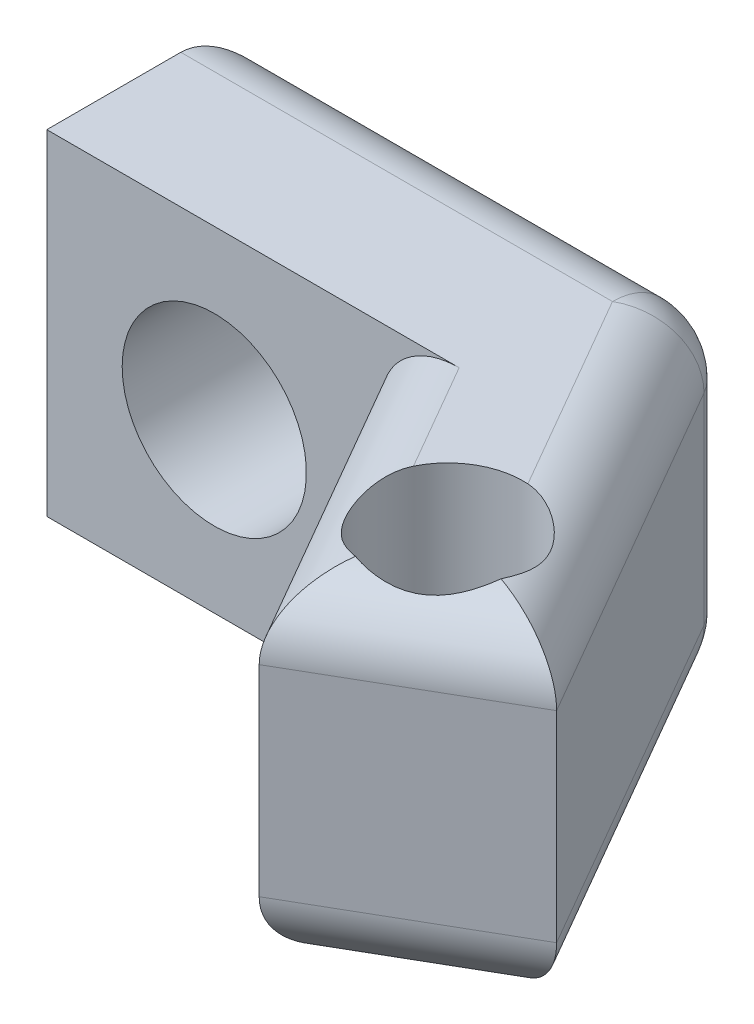
ISO-10303-21;
HEADER;
FILE_DESCRIPTION(('STEP AP214'),'2;1');
FILE_NAME('part.step','',(''),(''),'','','');
FILE_SCHEMA(('AUTOMOTIVE_DESIGN { 1 0 10303 214 1 1 1 1 }'));
ENDSEC;
DATA;
#1=APPLICATION_CONTEXT('core data for automotive mechanical design processes');
#2=APPLICATION_PROTOCOL_DEFINITION('international standard','automotive_design',2000,#1);
#3=PRODUCT_CONTEXT('',#1,'mechanical');
#4=PRODUCT('Part','Part','',(#3));
#5=PRODUCT_RELATED_PRODUCT_CATEGORY('part','',(#4));
#6=PRODUCT_DEFINITION_FORMATION('','',#4);
#7=PRODUCT_DEFINITION_CONTEXT('part definition',#1,'design');
#8=PRODUCT_DEFINITION('design','',#6,#7);
#9=PRODUCT_DEFINITION_SHAPE('','',#8);
#10=(LENGTH_UNIT() NAMED_UNIT(*) SI_UNIT(.MILLI.,.METRE.));
#11=(NAMED_UNIT(*) PLANE_ANGLE_UNIT() SI_UNIT($,.RADIAN.));
#12=(NAMED_UNIT(*) SI_UNIT($,.STERADIAN.) SOLID_ANGLE_UNIT());
#13=UNCERTAINTY_MEASURE_WITH_UNIT(LENGTH_MEASURE(1.E-05),#10,'distance_accuracy_value','');
#14=(GEOMETRIC_REPRESENTATION_CONTEXT(3) GLOBAL_UNCERTAINTY_ASSIGNED_CONTEXT((#13)) GLOBAL_UNIT_ASSIGNED_CONTEXT((#10,
#11,#12)) REPRESENTATION_CONTEXT('',''));
#15=CARTESIAN_POINT('',(0.,0.,0.));
#16=DIRECTION('',(0.,0.,1.));
#17=DIRECTION('',(1.,0.,0.));
#18=AXIS2_PLACEMENT_3D('',#15,#16,#17);
#19=CARTESIAN_POINT('',(-8.06381127356736,10.,-3.58771929824561));
#20=DIRECTION('',(0.,0.,1.));
#21=DIRECTION('',(1.,0.,0.));
#22=AXIS2_PLACEMENT_3D('',#19,#20,#21);
#23=PLANE('',#22);
#24=DIRECTION('',(-1.,0.,0.));
#25=VECTOR('',#24,1.);
#26=CARTESIAN_POINT('',(-8.06381127356736,8.,-3.58771929824561));
#27=LINE('',#26,#25);
#28=CARTESIAN_POINT('',(-20.1052631578947,8.,-3.58771929824561));
#29=VERTEX_POINT('',#28);
#30=CARTESIAN_POINT('',(-9.21851181194661,8.,-3.58771929824561));
#31=VERTEX_POINT('',#30);
#32=EDGE_CURVE('E300',#29,#31,#27,.F.);
#33=ORIENTED_EDGE('',*,*,#32,.T.);
#34=DIRECTION('',(0.,-1.,0.));
#35=VECTOR('',#34,1.);
#36=CARTESIAN_POINT('',(-9.21851181194661,10.,-3.58771929824561));
#37=LINE('',#36,#35);
#38=CARTESIAN_POINT('',(-9.21851181194661,2.,-3.58771929824561));
#39=VERTEX_POINT('',#38);
#40=EDGE_CURVE('E66',#31,#39,#37,.T.);
#41=ORIENTED_EDGE('',*,*,#40,.T.);
#42=DIRECTION('',(-1.,0.,0.));
#43=VECTOR('',#42,1.);
#44=CARTESIAN_POINT('',(-8.06381127356736,2.,-3.58771929824561));
#45=LINE('',#44,#43);
#46=CARTESIAN_POINT('',(-20.1052631578947,2.,-3.58771929824561));
#47=VERTEX_POINT('',#46);
#48=EDGE_CURVE('E344',#39,#47,#45,.T.);
#49=ORIENTED_EDGE('',*,*,#48,.T.);
#50=DIRECTION('',(0.,-1.,0.));
#51=VECTOR('',#50,1.);
#52=CARTESIAN_POINT('',(-20.1052631578947,10.,-3.58771929824561));
#53=LINE('',#52,#51);
#54=EDGE_CURVE('E341',#47,#29,#53,.F.);
#55=ORIENTED_EDGE('',*,*,#54,.T.);
#56=EDGE_LOOP('',(#33,#41,#49,#55));
#57=FACE_BOUND('',#56,.T.);
#58=CARTESIAN_POINT('',(-17.1052631578947,5.,-3.58771929824561));
#59=DIRECTION('',(0.,0.,1.));
#60=DIRECTION('',(1.,0.,0.));
#61=AXIS2_PLACEMENT_3D('',#58,#59,#60);
#62=CIRCLE('',#61,2.75);
#63=CARTESIAN_POINT('',(-19.8552631578947,5.,-3.58771929824561));
#64=VERTEX_POINT('',#63);
#65=EDGE_CURVE('E184',#64,#64,#62,.T.);
#66=ORIENTED_EDGE('',*,*,#65,.T.);
#67=EDGE_LOOP('',(#66));
#68=FACE_BOUND('',#67,.T.);
#69=ADVANCED_FACE('F39',(#57,#68),#23,.F.);
#70=CARTESIAN_POINT('',(-22.1052631578947,10.,-3.58771929824561));
#71=DIRECTION('',(1.,0.,0.));
#72=DIRECTION('',(0.,0.,-1.));
#73=AXIS2_PLACEMENT_3D('',#70,#71,#72);
#74=PLANE('',#73);
#75=DIRECTION('',(0.,0.,1.));
#76=VECTOR('',#75,1.);
#77=CARTESIAN_POINT('',(-22.1052631578947,10.,-3.58771929824561));
#78=LINE('',#77,#76);
#79=CARTESIAN_POINT('',(-22.1052631578947,10.,-1.58771929824561));
#80=VERTEX_POINT('',#79);
#81=CARTESIAN_POINT('',(-22.1052631578947,10.,2.41228070175439));
#82=VERTEX_POINT('',#81);
#83=EDGE_CURVE('E146',#80,#82,#78,.T.);
#84=ORIENTED_EDGE('',*,*,#83,.F.);
#85=DIRECTION('',(0.,-1.,0.));
#86=VECTOR('',#85,1.);
#87=CARTESIAN_POINT('',(-22.1052631578947,10.,-1.58771929824561));
#88=LINE('',#87,#86);
#89=CARTESIAN_POINT('',(-22.1052631578947,0.,-1.58771929824561));
#90=VERTEX_POINT('',#89);
#91=EDGE_CURVE('E351',#80,#90,#88,.T.);
#92=ORIENTED_EDGE('',*,*,#91,.T.);
#93=DIRECTION('',(0.,0.,1.));
#94=VECTOR('',#93,1.);
#95=CARTESIAN_POINT('',(-22.1052631578947,0.,-3.58771929824561));
#96=LINE('',#95,#94);
#97=CARTESIAN_POINT('',(-22.1052631578947,0.,2.41228070175439));
#98=VERTEX_POINT('',#97);
#99=EDGE_CURVE('E162',#90,#98,#96,.T.);
#100=ORIENTED_EDGE('',*,*,#99,.T.);
#101=DIRECTION('',(0.,-1.,0.));
#102=VECTOR('',#101,1.);
#103=CARTESIAN_POINT('',(-22.1052631578947,10.,2.41228070175439));
#104=LINE('',#103,#102);
#105=EDGE_CURVE('E159',#82,#98,#104,.T.);
#106=ORIENTED_EDGE('',*,*,#105,.F.);
#107=EDGE_LOOP('',(#84,#92,#100,#106));
#108=FACE_BOUND('',#107,.T.);
#109=ADVANCED_FACE('F160',(#108),#74,.F.);
#110=CARTESIAN_POINT('',(-22.1052631578947,10.,2.41228070175439));
#111=DIRECTION('',(0.,0.,-1.));
#112=DIRECTION('',(-1.,0.,0.));
#113=AXIS2_PLACEMENT_3D('',#110,#111,#112);
#114=PLANE('',#113);
#115=CARTESIAN_POINT('',(-17.1052631578947,5.,2.41228070175439));
#116=DIRECTION('',(0.,0.,-1.));
#117=DIRECTION('',(-1.,0.,0.));
#118=AXIS2_PLACEMENT_3D('',#115,#116,#117);
#119=CIRCLE('',#118,2.75);
#120=CARTESIAN_POINT('',(-19.8552631578947,5.,2.41228070175439));
#121=VERTEX_POINT('',#120);
#122=EDGE_CURVE('E193',#121,#121,#119,.T.);
#123=ORIENTED_EDGE('',*,*,#122,.T.);
#124=EDGE_LOOP('',(#123));
#125=FACE_BOUND('',#124,.T.);
#126=DIRECTION('',(1.,0.,0.));
#127=VECTOR('',#126,1.);
#128=CARTESIAN_POINT('',(-22.1052631578947,0.,2.41228070175439));
#129=LINE('',#128,#127);
#130=CARTESIAN_POINT('',(-9.79586208113624,0.,2.41228070175439));
#131=VERTEX_POINT('',#130);
#132=EDGE_CURVE('E156',#98,#131,#129,.T.);
#133=ORIENTED_EDGE('',*,*,#132,.T.);
#134=CARTESIAN_POINT('',(-9.79586208113624,2.,2.41228070175439));
#135=DIRECTION('',(0.,0.,-1.));
#136=DIRECTION('',(1.,0.,0.));
#137=AXIS2_PLACEMENT_3D('',#134,#135,#136);
#138=ELLIPSE('',#137,2.3094010767585,2.);
#139=CARTESIAN_POINT('',(-12.1052631578947,2.,2.41228070175439));
#140=VERTEX_POINT('',#139);
#141=EDGE_CURVE('E50',#131,#140,#138,.T.);
#142=ORIENTED_EDGE('',*,*,#141,.T.);
#143=DIRECTION('',(0.,-1.,0.));
#144=VECTOR('',#143,1.);
#145=CARTESIAN_POINT('',(-12.1052631578947,10.,2.41228070175439));
#146=LINE('',#145,#144);
#147=CARTESIAN_POINT('',(-12.1052631578947,8.,2.41228070175439));
#148=VERTEX_POINT('',#147);
#149=EDGE_CURVE('E167',#148,#140,#146,.T.);
#150=ORIENTED_EDGE('',*,*,#149,.F.);
#151=CARTESIAN_POINT('',(-9.79586208113624,8.,2.41228070175439));
#152=DIRECTION('',(0.,0.,-1.));
#153=DIRECTION('',(-1.,0.,0.));
#154=AXIS2_PLACEMENT_3D('',#151,#152,#153);
#155=ELLIPSE('',#154,2.3094010767585,2.);
#156=CARTESIAN_POINT('',(-9.79586208113624,10.,2.41228070175439));
#157=VERTEX_POINT('',#156);
#158=EDGE_CURVE('E11',#148,#157,#155,.T.);
#159=ORIENTED_EDGE('',*,*,#158,.T.);
#160=DIRECTION('',(1.,0.,0.));
#161=VECTOR('',#160,1.);
#162=CARTESIAN_POINT('',(-22.1052631578947,10.,2.41228070175439));
#163=LINE('',#162,#161);
#164=EDGE_CURVE('E150',#82,#157,#163,.T.);
#165=ORIENTED_EDGE('',*,*,#164,.F.);
#166=ORIENTED_EDGE('',*,*,#105,.T.);
#167=EDGE_LOOP('',(#133,#142,#150,#159,#165,#166));
#168=FACE_BOUND('',#167,.T.);
#169=ADVANCED_FACE('F169',(#125,#168),#114,.F.);
#170=CARTESIAN_POINT('',(-12.1052631578947,10.,2.41228070175439));
#171=DIRECTION('',(0.86602540378444,0.,-0.499999999999998));
#172=DIRECTION('',(-0.499999999999998,0.,-0.86602540378444));
#173=AXIS2_PLACEMENT_3D('',#170,#171,#172);
#174=PLANE('',#173);
#175=ORIENTED_EDGE('',*,*,#149,.T.);
#176=DIRECTION('',(0.499999999999998,0.,0.86602540378444));
#177=VECTOR('',#176,1.);
#178=CARTESIAN_POINT('',(-12.1052631578947,2.,2.41228070175439));
#179=LINE('',#178,#177);
#180=CARTESIAN_POINT('',(-7.10526315789476,2.,11.0725347395988));
#181=VERTEX_POINT('',#180);
#182=EDGE_CURVE('E406',#140,#181,#179,.T.);
#183=ORIENTED_EDGE('',*,*,#182,.T.);
#184=DIRECTION('',(0.,-1.,0.));
#185=VECTOR('',#184,1.);
#186=CARTESIAN_POINT('',(-7.10526315789476,10.,11.0725347395988));
#187=LINE('',#186,#185);
#188=CARTESIAN_POINT('',(-7.10526315789476,8.,11.0725347395988));
#189=VERTEX_POINT('',#188);
#190=EDGE_CURVE('E178',#189,#181,#187,.T.);
#191=ORIENTED_EDGE('',*,*,#190,.F.);
#192=DIRECTION('',(0.499999999999998,0.,0.86602540378444));
#193=VECTOR('',#192,1.);
#194=CARTESIAN_POINT('',(-12.1052631578947,8.,2.41228070175439));
#195=LINE('',#194,#193);
#196=EDGE_CURVE('E439',#189,#148,#195,.F.);
#197=ORIENTED_EDGE('',*,*,#196,.T.);
#198=EDGE_LOOP('',(#175,#183,#191,#197));
#199=FACE_BOUND('',#198,.T.);
#200=ADVANCED_FACE('F451',(#199),#174,.F.);
#201=CARTESIAN_POINT('',(-7.10526315789476,10.,11.0725347395988));
#202=DIRECTION('',(-0.499999999999998,0.,-0.86602540378444));
#203=DIRECTION('',(-0.86602540378444,0.,0.499999999999998));
#204=AXIS2_PLACEMENT_3D('',#201,#202,#203);
#205=PLANE('',#204);
#206=DIRECTION('',(0.,-1.,0.));
#207=VECTOR('',#206,1.);
#208=CARTESIAN_POINT('',(-1.47609803329591,10.,7.8225347395988));
#209=LINE('',#208,#207);
#210=CARTESIAN_POINT('',(-1.47609803329591,8.,7.8225347395988));
#211=VERTEX_POINT('',#210);
#212=CARTESIAN_POINT('',(-1.47609803329591,2.,7.8225347395988));
#213=VERTEX_POINT('',#212);
#214=EDGE_CURVE('E174',#211,#213,#209,.T.);
#215=ORIENTED_EDGE('',*,*,#214,.F.);
#216=DIRECTION('',(0.86602540378444,0.,-0.499999999999998));
#217=VECTOR('',#216,1.);
#218=CARTESIAN_POINT('',(-7.10526315789477,8.,11.0725347395988));
#219=LINE('',#218,#217);
#220=EDGE_CURVE('E433',#211,#189,#219,.F.);
#221=ORIENTED_EDGE('',*,*,#220,.T.);
#222=ORIENTED_EDGE('',*,*,#190,.T.);
#223=DIRECTION('',(0.86602540378444,0.,-0.499999999999998));
#224=VECTOR('',#223,1.);
#225=CARTESIAN_POINT('',(-7.10526315789476,2.,11.0725347395988));
#226=LINE('',#225,#224);
#227=EDGE_CURVE('E400',#181,#213,#226,.T.);
#228=ORIENTED_EDGE('',*,*,#227,.T.);
#229=EDGE_LOOP('',(#215,#221,#222,#228));
#230=FACE_BOUND('',#229,.T.);
#231=ADVANCED_FACE('F432',(#230),#205,.F.);
#232=CARTESIAN_POINT('',(-1.47609803329591,10.,7.8225347395988));
#233=DIRECTION('',(-0.86602540378444,0.,0.499999999999998));
#234=DIRECTION('',(0.499999999999998,0.,0.86602540378444));
#235=AXIS2_PLACEMENT_3D('',#232,#233,#234);
#236=PLANE('',#235);
#237=DIRECTION('',(0.,-1.,0.));
#238=VECTOR('',#237,1.);
#239=CARTESIAN_POINT('',(-7.48646100437773,10.,-2.58771929824561));
#240=LINE('',#239,#238);
#241=CARTESIAN_POINT('',(-7.48646100437773,2.,-2.58771929824561));
#242=VERTEX_POINT('',#241);
#243=CARTESIAN_POINT('',(-7.48646100437773,8.,-2.58771929824561));
#244=VERTEX_POINT('',#243);
#245=EDGE_CURVE('E327',#242,#244,#240,.F.);
#246=ORIENTED_EDGE('',*,*,#245,.T.);
#247=DIRECTION('',(-0.499999999999998,0.,-0.86602540378444));
#248=VECTOR('',#247,1.);
#249=CARTESIAN_POINT('',(-1.47609803329591,8.,7.8225347395988));
#250=LINE('',#249,#248);
#251=EDGE_CURVE('E338',#244,#211,#250,.F.);
#252=ORIENTED_EDGE('',*,*,#251,.T.);
#253=ORIENTED_EDGE('',*,*,#214,.T.);
#254=DIRECTION('',(-0.499999999999998,0.,-0.86602540378444));
#255=VECTOR('',#254,1.);
#256=CARTESIAN_POINT('',(-1.47609803329591,2.,7.8225347395988));
#257=LINE('',#256,#255);
#258=EDGE_CURVE('E335',#213,#242,#257,.T.);
#259=ORIENTED_EDGE('',*,*,#258,.T.);
#260=EDGE_LOOP('',(#246,#252,#253,#259));
#261=FACE_BOUND('',#260,.T.);
#262=ADVANCED_FACE('F427',(#261),#236,.F.);
#263=CARTESIAN_POINT('',(0.,10.,0.));
#264=DIRECTION('',(0.,1.,0.));
#265=DIRECTION('',(0.,0.,1.));
#266=AXIS2_PLACEMENT_3D('',#263,#264,#265);
#267=PLANE('',#266);
#268=ORIENTED_EDGE('',*,*,#164,.T.);
#269=DIRECTION('',(0.499999999999998,0.,0.86602540378444));
#270=VECTOR('',#269,1.);
#271=CARTESIAN_POINT('',(-5.37321235032588,10.,10.0725347395988));
#272=LINE('',#271,#270);
#273=CARTESIAN_POINT('',(-7.93362669701937,10.,5.63776700269738));
#274=VERTEX_POINT('',#273);
#275=EDGE_CURVE('E315',#157,#274,#272,.T.);
#276=ORIENTED_EDGE('',*,*,#275,.T.);
#277=CARTESIAN_POINT('',(-5.91568059559534,10.,6.63295217729936));
#278=DIRECTION('',(0.,-1.,0.));
#279=DIRECTION('',(0.,0.,-1.));
#280=AXIS2_PLACEMENT_3D('',#277,#278,#279);
#281=CIRCLE('',#280,2.25);
#282=CARTESIAN_POINT('',(-5.76856318755826,10.,4.3877670026974));
#283=VERTEX_POINT('',#282);
#284=EDGE_CURVE('E197',#274,#283,#281,.T.);
#285=ORIENTED_EDGE('',*,*,#284,.T.);
#286=DIRECTION('',(-0.499999999999998,0.,-0.86602540378444));
#287=VECTOR('',#286,1.);
#288=CARTESIAN_POINT('',(-9.79586208113624,10.,-2.58771929824562));
#289=LINE('',#288,#287);
#290=CARTESIAN_POINT('',(-9.21851181194661,10.,-1.58771929824561));
#291=VERTEX_POINT('',#290);
#292=EDGE_CURVE('E314',#283,#291,#289,.T.);
#293=ORIENTED_EDGE('',*,*,#292,.T.);
#294=DIRECTION('',(-1.,0.,0.));
#295=VECTOR('',#294,1.);
#296=CARTESIAN_POINT('',(-22.1052631578947,10.,-1.58771929824561));
#297=LINE('',#296,#295);
#298=EDGE_CURVE('E152',#291,#80,#297,.T.);
#299=ORIENTED_EDGE('',*,*,#298,.T.);
#300=ORIENTED_EDGE('',*,*,#83,.T.);
#301=EDGE_LOOP('',(#268,#276,#285,#293,#299,#300));
#302=FACE_BOUND('',#301,.T.);
#303=ADVANCED_FACE('F148',(#302),#267,.T.);
#304=CARTESIAN_POINT('',(0.,0.,0.));
#305=DIRECTION('',(0.,1.,0.));
#306=DIRECTION('',(0.,0.,1.));
#307=AXIS2_PLACEMENT_3D('',#304,#305,#306);
#308=PLANE('',#307);
#309=CARTESIAN_POINT('',(-5.91568059559534,0.,6.63295217729936));
#310=DIRECTION('',(0.,-1.,0.));
#311=DIRECTION('',(0.,0.,-1.));
#312=AXIS2_PLACEMENT_3D('',#309,#310,#311);
#313=CIRCLE('',#312,2.25);
#314=CARTESIAN_POINT('',(-7.93362669701937,0.,5.63776700269738));
#315=VERTEX_POINT('',#314);
#316=CARTESIAN_POINT('',(-5.76856318755826,0.,4.3877670026974));
#317=VERTEX_POINT('',#316);
#318=EDGE_CURVE('E306',#315,#317,#313,.T.);
#319=ORIENTED_EDGE('',*,*,#318,.F.);
#320=DIRECTION('',(0.499999999999998,0.,0.86602540378444));
#321=VECTOR('',#320,1.);
#322=CARTESIAN_POINT('',(-8.39144474524133,0.,4.84480288255492));
#323=LINE('',#322,#321);
#324=EDGE_CURVE('E329',#315,#131,#323,.F.);
#325=ORIENTED_EDGE('',*,*,#324,.T.);
#326=ORIENTED_EDGE('',*,*,#132,.F.);
#327=ORIENTED_EDGE('',*,*,#99,.F.);
#328=DIRECTION('',(-1.,0.,0.));
#329=VECTOR('',#328,1.);
#330=CARTESIAN_POINT('',(0.,0.,-1.58771929824561));
#331=LINE('',#330,#329);
#332=CARTESIAN_POINT('',(-9.21851181194661,0.,-1.58771929824561));
#333=VERTEX_POINT('',#332);
#334=EDGE_CURVE('E420',#90,#333,#331,.F.);
#335=ORIENTED_EDGE('',*,*,#334,.T.);
#336=DIRECTION('',(-0.499999999999998,0.,-0.86602540378444));
#337=VECTOR('',#336,1.);
#338=CARTESIAN_POINT('',(-6.22638123578023,0.,3.59480288255493));
#339=LINE('',#338,#337);
#340=EDGE_CURVE('E415',#333,#317,#339,.F.);
#341=ORIENTED_EDGE('',*,*,#340,.T.);
#342=EDGE_LOOP('',(#319,#325,#326,#327,#335,#341));
#343=FACE_BOUND('',#342,.T.);
#344=ADVANCED_FACE('F449',(#343),#308,.F.);
#345=CARTESIAN_POINT('',(-17.1052631578947,5.,11.0725347395988));
#346=DIRECTION('',(0.,0.,-1.));
#347=DIRECTION('',(-1.,0.,0.));
#348=AXIS2_PLACEMENT_3D('',#345,#346,#347);
#349=CYLINDRICAL_SURFACE('',#348,2.75);
#350=CARTESIAN_POINT('',(-19.8552631578947,5.,2.41228070175439));
#351=CARTESIAN_POINT('',(-19.8552631578947,5.,2.34978070175439));
#352=CARTESIAN_POINT('',(-19.8552631578947,5.,2.28728070175439));
#353=CARTESIAN_POINT('',(-19.8552631578947,5.,2.16228070175439));
#354=CARTESIAN_POINT('',(-19.8552631578947,5.,2.09978070175439));
#355=CARTESIAN_POINT('',(-19.8552631578947,5.,1.97478070175439));
#356=CARTESIAN_POINT('',(-19.8552631578947,5.,1.91228070175439));
#357=CARTESIAN_POINT('',(-19.8552631578947,5.,1.78728070175439));
#358=CARTESIAN_POINT('',(-19.8552631578947,5.,1.72478070175439));
#359=CARTESIAN_POINT('',(-19.8552631578947,5.,1.59978070175439));
#360=CARTESIAN_POINT('',(-19.8552631578947,5.,1.53728070175439));
#361=CARTESIAN_POINT('',(-19.8552631578947,5.,1.41228070175439));
#362=CARTESIAN_POINT('',(-19.8552631578947,5.,1.34978070175439));
#363=CARTESIAN_POINT('',(-19.8552631578947,5.,1.22478070175439));
#364=CARTESIAN_POINT('',(-19.8552631578947,5.,1.16228070175439));
#365=CARTESIAN_POINT('',(-19.8552631578947,5.,1.03728070175439));
#366=CARTESIAN_POINT('',(-19.8552631578947,5.,0.974780701754387));
#367=CARTESIAN_POINT('',(-19.8552631578947,5.,0.849780701754387));
#368=CARTESIAN_POINT('',(-19.8552631578947,5.,0.787280701754387));
#369=CARTESIAN_POINT('',(-19.8552631578947,5.,0.662280701754387));
#370=CARTESIAN_POINT('',(-19.8552631578947,5.,0.599780701754387));
#371=CARTESIAN_POINT('',(-19.8552631578947,5.,0.474780701754387));
#372=CARTESIAN_POINT('',(-19.8552631578947,5.,0.412280701754388));
#373=CARTESIAN_POINT('',(-19.8552631578947,5.,0.287280701754388));
#374=CARTESIAN_POINT('',(-19.8552631578947,5.,0.224780701754388));
#375=CARTESIAN_POINT('',(-19.8552631578947,5.,0.0997807017543879));
#376=CARTESIAN_POINT('',(-19.8552631578947,5.,0.0372807017543879));
#377=CARTESIAN_POINT('',(-19.8552631578947,5.,-0.0877192982456122));
#378=CARTESIAN_POINT('',(-19.8552631578947,5.,-0.150219298245612));
#379=CARTESIAN_POINT('',(-19.8552631578947,5.,-0.275219298245612));
#380=CARTESIAN_POINT('',(-19.8552631578947,5.,-0.337719298245612));
#381=CARTESIAN_POINT('',(-19.8552631578947,5.,-0.462719298245613));
#382=CARTESIAN_POINT('',(-19.8552631578947,5.,-0.525219298245613));
#383=CARTESIAN_POINT('',(-19.8552631578947,5.,-0.650219298245613));
#384=CARTESIAN_POINT('',(-19.8552631578947,5.,-0.712719298245613));
#385=CARTESIAN_POINT('',(-19.8552631578947,5.,-0.837719298245613));
#386=CARTESIAN_POINT('',(-19.8552631578947,5.,-0.900219298245613));
#387=CARTESIAN_POINT('',(-19.8552631578947,5.,-1.02521929824561));
#388=CARTESIAN_POINT('',(-19.8552631578947,5.,-1.08771929824561));
#389=CARTESIAN_POINT('',(-19.8552631578947,5.,-1.21271929824561));
#390=CARTESIAN_POINT('',(-19.8552631578947,5.,-1.27521929824561));
#391=CARTESIAN_POINT('',(-19.8552631578947,5.,-1.40021929824561));
#392=CARTESIAN_POINT('',(-19.8552631578947,5.,-1.46271929824561));
#393=CARTESIAN_POINT('',(-19.8552631578947,5.,-1.58771929824561));
#394=CARTESIAN_POINT('',(-19.8552631578947,5.,-1.65021929824561));
#395=CARTESIAN_POINT('',(-19.8552631578947,5.,-1.77521929824561));
#396=CARTESIAN_POINT('',(-19.8552631578947,5.,-1.83771929824561));
#397=CARTESIAN_POINT('',(-19.8552631578947,5.,-1.96271929824561));
#398=CARTESIAN_POINT('',(-19.8552631578947,5.,-2.02521929824561));
#399=CARTESIAN_POINT('',(-19.8552631578947,5.,-2.15021929824561));
#400=CARTESIAN_POINT('',(-19.8552631578947,5.,-2.21271929824561));
#401=CARTESIAN_POINT('',(-19.8552631578947,5.,-2.33771929824561));
#402=CARTESIAN_POINT('',(-19.8552631578947,5.,-2.40021929824561));
#403=CARTESIAN_POINT('',(-19.8552631578947,5.,-2.52521929824561));
#404=CARTESIAN_POINT('',(-19.8552631578947,5.,-2.58771929824561));
#405=CARTESIAN_POINT('',(-19.8552631578947,5.,-2.71271929824561));
#406=CARTESIAN_POINT('',(-19.8552631578947,5.,-2.77521929824561));
#407=CARTESIAN_POINT('',(-19.8552631578947,5.,-2.90021929824561));
#408=CARTESIAN_POINT('',(-19.8552631578947,5.,-2.96271929824561));
#409=CARTESIAN_POINT('',(-19.8552631578947,5.,-3.08771929824561));
#410=CARTESIAN_POINT('',(-19.8552631578947,5.,-3.15021929824561));
#411=CARTESIAN_POINT('',(-19.8552631578947,5.,-3.27521929824561));
#412=CARTESIAN_POINT('',(-19.8552631578947,5.,-3.33771929824561));
#413=CARTESIAN_POINT('',(-19.8552631578947,5.,-3.46271929824561));
#414=CARTESIAN_POINT('',(-19.8552631578947,5.,-3.52521929824561));
#415=CARTESIAN_POINT('',(-19.8552631578947,5.,-3.58771929824561));
#416=B_SPLINE_CURVE_WITH_KNOTS('',3,(#350,#351,#352,#353,#354,#355,#356,#357,#358,#359,#360,
#361,#362,#363,#364,#365,#366,#367,#368,#369,#370,#371,#372,#373,#374,#375,#376,#377,#378,#379,
#380,#381,#382,#383,#384,#385,#386,#387,#388,#389,#390,#391,#392,#393,#394,#395,#396,#397,#398,
#399,#400,#401,#402,#403,#404,#405,#406,#407,#408,#409,#410,#411,#412,#413,#414,#415),
.UNSPECIFIED.,.F.,.F.,(4,2,2,2,2,2,2,2,2,2,2,2,2,2,2,2,2,2,2,2,2,2,2,2,2,2,2,2,2,2,2,2,4),(0.,
0.1875,0.375,0.5625,0.750000000000001,0.937499999999999,1.125,1.3125,1.5,1.6875,1.875,2.0625,
2.25,2.4375,2.625,2.8125,3.,3.1875,3.375,3.5625,3.75,3.9375,4.125,4.3125,4.5,4.6875,4.875,
5.0625,5.25,5.4375,5.625,5.8125,6.),.UNSPECIFIED.);
#417=EDGE_CURVE('BSEAM220',#121,#64,#416,.T.);
#418=ORIENTED_EDGE('',*,*,#122,.F.);
#419=ORIENTED_EDGE('',*,*,#65,.F.);
#420=ORIENTED_EDGE('',*,*,#417,.T.);
#421=ORIENTED_EDGE('',*,*,#417,.F.);
#422=EDGE_LOOP('',(#418,#420,#419,#421));
#423=FACE_BOUND('',#422,.T.);
#424=ADVANCED_FACE('F220',(#423),#349,.F.);
#425=CARTESIAN_POINT('',(-5.91568059559534,10.,6.63295217729936));
#426=DIRECTION('',(0.,-1.,0.));
#427=DIRECTION('',(0.,0.,-1.));
#428=AXIS2_PLACEMENT_3D('',#425,#426,#427);
#429=CYLINDRICAL_SURFACE('',#428,2.25);
#430=ORIENTED_EDGE('',*,*,#284,.F.);
#431=CARTESIAN_POINT('',(-7.93362669701937,10.,5.63776700269738));
#432=CARTESIAN_POINT('',(-7.9599488716695,10.0000016193628,5.69112665843927));
#433=CARTESIAN_POINT('',(-7.98411525073189,9.99816446079613,5.74548012489291));
#434=CARTESIAN_POINT('',(-8.02799552731899,9.99143461900005,5.85569214492756));
#435=CARTESIAN_POINT('',(-8.04771543813572,9.98654609650679,5.91154855007246));
#436=CARTESIAN_POINT('',(-8.09988222619302,9.96829913269367,6.08018990333219));
#437=CARTESIAN_POINT('',(-8.12565644213559,9.95134419704659,6.19470158842354));
#438=CARTESIAN_POINT('',(-8.15904949927221,9.91282037183088,6.4248897280975));
#439=CARTESIAN_POINT('',(-8.16674970895343,9.89127263925039,6.54055859891945));
#440=CARTESIAN_POINT('',(-8.16437032055872,9.8481167117479,6.77193427576304));
#441=CARTESIAN_POINT('',(-8.15425388564021,9.82650848399817,6.88764066468977));
#442=CARTESIAN_POINT('',(-8.11398917395067,9.78575068458364,7.12941254094136));
#443=CARTESIAN_POINT('',(-8.08179794287035,9.76711769379828,7.25524924799521));
#444=CARTESIAN_POINT('',(-8.01736566482492,9.74734544390729,7.4389572883558));
#445=CARTESIAN_POINT('',(-7.99321259975525,9.74211811001784,7.49932471436781));
#446=CARTESIAN_POINT('',(-7.93968208899112,9.73476464139965,7.61790969486631));
#447=CARTESIAN_POINT('',(-7.91030551071082,9.73263799231124,7.67612760436504));
#448=CARTESIAN_POINT('',(-7.85001031253504,9.73172718909927,7.78371472886895));
#449=CARTESIAN_POINT('',(-7.81959398990301,9.73260937979756,7.83336377104833));
#450=CARTESIAN_POINT('',(-7.75506200372763,9.73692404031809,7.93008818582309));
#451=CARTESIAN_POINT('',(-7.72094507034146,9.74035738793422,7.97716266658486));
#452=CARTESIAN_POINT('',(-7.61340390392778,9.75419545745308,8.11405850503724));
#453=CARTESIAN_POINT('',(-7.53479540516097,9.76813822794465,8.19954141897034));
#454=CARTESIAN_POINT('',(-7.368416661074,9.80169847276408,8.35478784663424));
#455=CARTESIAN_POINT('',(-7.28093216417649,9.82116168693175,8.42489748891683));
#456=CARTESIAN_POINT('',(-7.09691284439668,9.86192464043428,8.55118478701885));
#457=CARTESIAN_POINT('',(-7.00038676286914,9.88322260437491,8.60737571164457));
#458=CARTESIAN_POINT('',(-6.83587842775254,9.91627718919295,8.68742012937951));
#459=CARTESIAN_POINT('',(-6.77012181486354,9.92870965987177,8.71563441025242));
#460=CARTESIAN_POINT('',(-6.63596527768463,9.95152305322882,8.76574599627548));
#461=CARTESIAN_POINT('',(-6.56756735905022,9.96190549732986,8.78764799166556));
#462=CARTESIAN_POINT('',(-6.49802344707601,9.97071703807886,8.80628528644977));
#463=B_SPLINE_CURVE_WITH_KNOTS('',3,(#431,#432,#433,#434,#435,#436,#437,#438,#439,#440,#441,
#442,#443,#444,#445,#446,#447,#448,#449,#450,#451,#452,#453,#454,#455,#456,#457,#458,#459,#460,
#461,#462),.UNSPECIFIED.,.F.,.F.,(4,2,2,2,2,2,2,2,2,2,2,2,2,2,2,4),(0.,0.178318353179748,
0.356394087089718,0.710391213615652,1.06279157614287,1.4159214004146,1.80714004931397,
2.00256421865474,2.1979559662049,2.37241668877447,2.54693746704254,2.89601582027415,
3.23616595287878,3.57599055921583,3.79354771965538,4.01094280858605),.UNSPECIFIED.);
#464=CARTESIAN_POINT('',(-6.49802344707601,9.97071703807886,8.80628528644977));
#465=VERTEX_POINT('',#464);
#466=EDGE_CURVE('E249',#274,#465,#463,.T.);
#467=ORIENTED_EDGE('',*,*,#466,.T.);
#468=CARTESIAN_POINT('',(-6.49802344707601,9.97071703807886,8.80628528644977));
#469=CARTESIAN_POINT('',(-6.37472330505749,9.95507492005655,8.83931804064052));
#470=CARTESIAN_POINT('',(-6.24940882410893,9.93452700275581,8.86165862761816));
#471=CARTESIAN_POINT('',(-5.99761272636717,9.88973166217527,8.88500754738209));
#472=CARTESIAN_POINT('',(-5.8711330543886,9.86548961933497,8.88604661194222));
#473=CARTESIAN_POINT('',(-5.65707584902657,9.82623015224394,8.86979288134144));
#474=CARTESIAN_POINT('',(-5.5691621366914,9.81062012994217,8.85788269958077));
#475=CARTESIAN_POINT('',(-5.39486638867344,9.78249271151536,8.8236455121511));
#476=CARTESIAN_POINT('',(-5.3084840608646,9.76997471953354,8.80132051589186));
#477=CARTESIAN_POINT('',(-5.11703720245478,9.74725715431094,8.73940640598935));
#478=CARTESIAN_POINT('',(-5.0127286779628,9.7384292185163,8.69688974424347));
#479=CARTESIAN_POINT('',(-4.81136862893177,9.73052935050795,8.59653142603028));
#480=CARTESIAN_POINT('',(-4.71431581708815,9.73145568354053,8.53869249634437));
#481=CARTESIAN_POINT('',(-4.53055028847235,9.7428069971109,8.40960824949325));
#482=CARTESIAN_POINT('',(-4.44381689434131,9.7532126085357,8.33839050485748));
#483=CARTESIAN_POINT('',(-4.28236590142567,9.78106031619873,8.18448594279981));
#484=CARTESIAN_POINT('',(-4.20766750582926,9.79851350508103,8.10178118046615));
#485=CARTESIAN_POINT('',(-4.06800943472497,9.83783241920118,7.92222849547277));
#486=CARTESIAN_POINT('',(-4.00376731849918,9.85988175431653,7.8248658911583));
#487=CARTESIAN_POINT('',(-3.89110157957013,9.90308174407921,7.62141195774616));
#488=CARTESIAN_POINT('',(-3.84264405152234,9.92423423892221,7.515339958807));
#489=CARTESIAN_POINT('',(-3.77973911000514,9.95301379627368,7.343362551677));
#490=CARTESIAN_POINT('',(-3.75962769012745,9.96254536605458,7.27980185806188));
#491=CARTESIAN_POINT('',(-3.74234748644494,9.97071703807887,7.21529502878004));
#492=B_SPLINE_CURVE_WITH_KNOTS('',3,(#468,#469,#470,#471,#472,#473,#474,#475,#476,#477,#478,
#479,#480,#481,#482,#483,#484,#485,#486,#487,#488,#489,#490,#491),.UNSPECIFIED.,.F.,.F.,(4,2,2,
2,2,2,2,2,2,2,2,4),(0.,0.385043867132275,0.769532191103411,1.03918266654178,1.30878113775575,
1.64608230034582,1.98332347642481,2.31987710577993,2.65696253670513,3.01175241048387,
3.36577509055315,3.56754280958347),.UNSPECIFIED.);
#493=CARTESIAN_POINT('',(-3.74234748644494,9.97071703807887,7.21529502878004));
#494=VERTEX_POINT('',#493);
#495=EDGE_CURVE('E242',#465,#494,#492,.T.);
#496=ORIENTED_EDGE('',*,*,#495,.T.);
#497=CARTESIAN_POINT('',(-3.74234748644494,9.97071703807887,7.21529502878004));
#498=CARTESIAN_POINT('',(-3.70942687796207,9.95511530557133,7.0922780182488));
#499=CARTESIAN_POINT('',(-3.68711231579949,9.93464417491028,6.96737268886637));
#500=CARTESIAN_POINT('',(-3.66362354504127,9.88987599160109,6.71566165564056));
#501=CARTESIAN_POINT('',(-3.66254237267057,9.86556257185335,6.58885002388513));
#502=CARTESIAN_POINT('',(-3.68173510920021,9.8192698142013,6.33634946732202));
#503=CARTESIAN_POINT('',(-3.70200455232817,9.79728998925214,6.21066031327724));
#504=CARTESIAN_POINT('',(-3.74830345907579,9.77033849052986,6.02547726522624));
#505=CARTESIAN_POINT('',(-3.76636553317687,9.762361531671,5.96435383158968));
#506=CARTESIAN_POINT('',(-3.80771366781175,9.74896482071259,5.84362389143895));
#507=CARTESIAN_POINT('',(-3.83099689455385,9.74354368636709,5.78401658151261));
#508=CARTESIAN_POINT('',(-3.88132004027398,9.73588401969241,5.66984885257543));
#509=CARTESIAN_POINT('',(-3.90810606856324,9.73349653015956,5.61518637832247));
#510=CARTESIAN_POINT('',(-3.96604551407526,9.73157694943989,5.50817460121482));
#511=CARTESIAN_POINT('',(-3.9971987757945,9.73204475661009,5.4558252160855));
#512=CARTESIAN_POINT('',(-4.06360407109091,9.73580358558028,5.35388497436026));
#513=CARTESIAN_POINT('',(-4.09885697661473,9.73909520892601,5.30429470792487));
#514=CARTESIAN_POINT('',(-4.17313452750812,9.74825805257718,5.20826850636666));
#515=CARTESIAN_POINT('',(-4.21216068983874,9.7541303137673,5.16183385277619));
#516=CARTESIAN_POINT('',(-4.32717222933026,9.77379809538503,5.03568228758247));
#517=CARTESIAN_POINT('',(-4.40717855450367,9.79013936682354,4.95996695474596));
#518=CARTESIAN_POINT('',(-4.57682434970882,9.82677608936795,4.82132108297296));
#519=CARTESIAN_POINT('',(-4.66647615830929,9.84707663282657,4.75840722431716));
#520=CARTESIAN_POINT('',(-4.86636018245126,9.89051647092162,4.63877723774488));
#521=CARTESIAN_POINT('',(-4.97774555455182,9.9136756605838,4.58398538277948));
#522=CARTESIAN_POINT('',(-5.20873090076598,9.95440192845597,4.4933208024772));
#523=CARTESIAN_POINT('',(-5.32830557245694,9.97198536334225,4.45739253293122));
#524=CARTESIAN_POINT('',(-5.50271999386954,9.98893856683008,4.42052706908884));
#525=CARTESIAN_POINT('',(-5.55544451153446,9.99297298679543,4.41133189124955));
#526=CARTESIAN_POINT('',(-5.66157535457002,9.99850482987994,4.39670472881853));
#527=CARTESIAN_POINT('',(-5.71498209511736,10.0000006259481,4.39127515899169));
#528=CARTESIAN_POINT('',(-5.76856318755826,10.,4.3877670026974));
#529=B_SPLINE_CURVE_WITH_KNOTS('',3,(#497,#498,#499,#500,#501,#502,#503,#504,#505,#506,#507,
#508,#509,#510,#511,#512,#513,#514,#515,#516,#517,#518,#519,#520,#521,#522,#523,#524,#525,#526,
#527,#528),.UNSPECIFIED.,.F.,.F.,(4,2,2,2,2,2,2,2,2,2,2,2,2,2,2,4),(0.,0.383925331478113,
0.769532496759629,1.15505902305689,1.34752596650988,1.53988869987383,1.7223864134847,
1.90487763057245,2.08740773265683,2.27001152482346,2.6026496278267,2.93571842019742,
3.3128975929321,3.68895983559918,3.84980655914693,4.01075633345767),.UNSPECIFIED.);
#530=EDGE_CURVE('E235',#494,#283,#529,.T.);
#531=ORIENTED_EDGE('',*,*,#530,.T.);
#532=EDGE_LOOP('',(#430,#467,#496,#531));
#533=FACE_BOUND('',#532,.T.);
#534=CARTESIAN_POINT('',(-3.74234748644494,0.029282961921135,7.21529502878004));
#535=CARTESIAN_POINT('',(-3.77535951983325,0.044907834657854,7.33844773989852));
#536=CARTESIAN_POINT('',(-3.81859228321481,0.0654205238485906,7.45798175118241));
#537=CARTESIAN_POINT('',(-3.9242064333406,0.110202597144815,7.68772497116223));
#538=CARTESIAN_POINT('',(-3.98661045873731,0.134476405734033,7.79792295795647));
#539=CARTESIAN_POINT('',(-4.11772987004329,0.176981160551502,7.98983149714978));
#540=CARTESIAN_POINT('',(-4.18381816703915,0.195556249198711,8.07327383124404));
#541=CARTESIAN_POINT('',(-4.32764213290739,0.227691733695336,8.23043534348398));
#542=CARTESIAN_POINT('',(-4.40536248851528,0.241258642460702,8.30416706896287));
#543=CARTESIAN_POINT('',(-4.57534720535948,0.261107397828217,8.44366396467674));
#544=CARTESIAN_POINT('',(-4.66814720744297,0.266987557011986,8.50884022662891));
#545=CARTESIAN_POINT('',(-4.86256631852216,0.268689775729826,8.62449484108559));
#546=CARTESIAN_POINT('',(-4.9641843104142,0.26451310752125,8.67497505183537));
#547=CARTESIAN_POINT('',(-5.17276149288854,0.247193592382162,8.75973687215759));
#548=CARTESIAN_POINT('',(-5.27970083377851,0.234082045454533,8.79407432453769));
#549=CARTESIAN_POINT('',(-5.49675587687683,0.201896997094769,8.84643591683235));
#550=CARTESIAN_POINT('',(-5.60687734174525,0.182811972404025,8.86442826184381));
#551=CARTESIAN_POINT('',(-5.84815356100703,0.138880066748529,8.88575703473052));
#552=CARTESIAN_POINT('',(-5.97952639199653,0.113614405266283,8.8858724681898));
#553=CARTESIAN_POINT('',(-6.24064375263411,0.0669179704082984,8.86320350266579));
#554=CARTESIAN_POINT('',(-6.37039112754778,0.0454792372131789,8.84046730321993));
#555=CARTESIAN_POINT('',(-6.49802344707601,0.029282961921131,8.80628528644977));
#556=B_SPLINE_CURVE_WITH_KNOTS('',3,(#534,#535,#536,#537,#538,#539,#540,#541,#542,#543,#544,
#545,#546,#547,#548,#549,#550,#551,#552,#553,#554,#555),.UNSPECIFIED.,.F.,.F.,(4,2,2,2,2,2,2,2,
2,2,4),(0.,0.384538245375376,0.769532334982528,1.09263887878906,1.41532374411316,
1.75427409584726,2.09318157029969,2.43090787144635,2.76928972804917,3.16857995622019,
3.56702974992309),.UNSPECIFIED.);
#557=CARTESIAN_POINT('',(-3.74234748644494,0.0292829619211351,7.21529502878004));
#558=VERTEX_POINT('',#557);
#559=CARTESIAN_POINT('',(-6.49802344707601,0.029282961921131,8.80628528644977));
#560=VERTEX_POINT('',#559);
#561=EDGE_CURVE('E206',#558,#560,#556,.T.);
#562=ORIENTED_EDGE('',*,*,#561,.T.);
#563=CARTESIAN_POINT('',(-6.49802344707601,0.0292829619211363,8.80628528644977));
#564=CARTESIAN_POINT('',(-6.62101960753511,0.0448846944286696,8.77328686443835));
#565=CARTESIAN_POINT('',(-6.74034807692965,0.0653558250897202,8.73015917745426));
#566=CARTESIAN_POINT('',(-6.97008061149513,0.110124008398918,8.62464553302164));
#567=CARTESIAN_POINT('',(-7.08044329227605,0.134437428146654,8.56217603988282));
#568=CARTESIAN_POINT('',(-7.28951882046459,0.180730185798705,8.41930436419845));
#569=CARTESIAN_POINT('',(-7.38823409928357,0.202710010747866,8.33890593450668));
#570=CARTESIAN_POINT('',(-7.52545786987216,0.229661509470145,8.20621838107031));
#571=CARTESIAN_POINT('',(-7.56936127911741,0.237638468329008,8.16001444923545));
#572=CARTESIAN_POINT('',(-7.65324240696788,0.251035179287419,8.06384094416718));
#573=CARTESIAN_POINT('',(-7.69322223824429,0.256456313632915,8.01387342336328));
#574=CARTESIAN_POINT('',(-7.7669328189362,0.264115980307599,7.91320843630271));
#575=CARTESIAN_POINT('',(-7.80087889612834,0.266503469840448,7.86267981821124));
#576=CARTESIAN_POINT('',(-7.86458409085168,0.268423050560122,7.75899689796282));
#577=CARTESIAN_POINT('',(-7.89434335738654,0.267955243389915,7.70584268933855));
#578=CARTESIAN_POINT('',(-7.94942354874033,0.264196414419728,7.59736389580344));
#579=CARTESIAN_POINT('',(-7.97474352649189,0.260904791074001,7.5420388508449));
#580=CARTESIAN_POINT('',(-8.02076588102353,0.251741947422831,7.42969950406123));
#581=CARTESIAN_POINT('',(-8.0414663894835,0.245869686232707,7.37268452927546));
#582=CARTESIAN_POINT('',(-8.09321107992268,0.226201904614976,7.21000583175059));
#583=CARTESIAN_POINT('',(-8.11877931902838,0.209860633176472,7.10286065526872));
#584=CARTESIAN_POINT('',(-8.15402726851106,0.173223910632058,6.88662015108935));
#585=CARTESIAN_POINT('',(-8.16368636405686,0.152923367173444,6.77752247801823));
#586=CARTESIAN_POINT('',(-8.16734695941186,0.109483529078389,6.54460284201448));
#587=CARTESIAN_POINT('',(-8.15910541168209,0.0863243394162121,6.42074435268271));
#588=CARTESIAN_POINT('',(-8.12213056834023,0.0455980715440311,6.17537288480816));
#589=CARTESIAN_POINT('',(-8.09345802663558,0.0280146366577551,6.05385404670162));
#590=CARTESIAN_POINT('',(-8.03817724413908,0.0110614331699226,5.88437399505075));
#591=CARTESIAN_POINT('',(-8.01977824290776,0.00702701320456662,5.83411563443099));
#592=CARTESIAN_POINT('',(-7.97938031564053,0.00149517012006081,5.73489004702162));
#593=CARTESIAN_POINT('',(-7.95737909076851,-6.25948090887887E-07,5.68592366806087));
#594=CARTESIAN_POINT('',(-7.93362669701937,0.,5.63776700269738));
#595=B_SPLINE_CURVE_WITH_KNOTS('',3,(#563,#564,#565,#566,#567,#568,#569,#570,#571,#572,#573,
#574,#575,#576,#577,#578,#579,#580,#581,#582,#583,#584,#585,#586,#587,#588,#589,#590,#591,#592,
#593,#594),.UNSPECIFIED.,.F.,.F.,(4,2,2,2,2,2,2,2,2,2,2,2,2,2,2,4),(0.,0.383925331478113,
0.76953249675963,1.15505902305689,1.34752596650988,1.53988869987383,1.7223864134847,
1.90487763057245,2.08740773265683,2.27001152482347,2.6026496278267,2.93571842019742,
3.3128975929321,3.68895983559917,3.84980655914694,4.01075633345769),.UNSPECIFIED.);
#596=EDGE_CURVE('E229',#560,#315,#595,.T.);
#597=ORIENTED_EDGE('',*,*,#596,.T.);
#598=ORIENTED_EDGE('',*,*,#318,.T.);
#599=CARTESIAN_POINT('',(-5.76856318755826,0.,4.3877670026974));
#600=CARTESIAN_POINT('',(-5.70919128282353,-1.61936278215639E-06,4.39165115863847));
#601=CARTESIAN_POINT('',(-5.65003661055974,0.00183553920387443,4.39789919367978));
#602=CARTESIAN_POINT('',(-5.53265006311378,0.00856538099995354,4.4150037694476));
#603=CARTESIAN_POINT('',(-5.47441704188586,0.0134539034932103,4.42585402829239));
#604=CARTESIAN_POINT('',(-5.30228595180569,0.0317008673063251,4.46499694123079));
#605=CARTESIAN_POINT('',(-5.19022881551513,0.0486558029534068,4.49993165800758));
#606=CARTESIAN_POINT('',(-4.97418351033929,0.0871796281691157,4.58610649205423));
#607=CARTESIAN_POINT('',(-4.87016122493981,0.10872736074961,4.6372723502668));
#608=CARTESIAN_POINT('',(-4.6709737051728,0.151883288252096,4.75502079948389));
#609=CARTESIAN_POINT('',(-4.57582725044135,0.173491516001826,4.82163508358241));
#610=CARTESIAN_POINT('',(-4.38657901953162,0.214249315416354,4.97739128490741));
#611=CARTESIAN_POINT('',(-4.29369685003456,0.232882306201709,5.06818806232899));
#612=CARTESIAN_POINT('',(-4.16681715922556,0.252654556092704,5.21584207212033));
#613=CARTESIAN_POINT('',(-4.12661396727291,0.257881889982158,5.26694295305593));
#614=CARTESIAN_POINT('',(-4.050681617036,0.265235358600343,5.37259422550448));
#615=CARTESIAN_POINT('',(-4.01495171759503,0.26736200768875,5.42714404332084));
#616=CARTESIAN_POINT('',(-3.95192613374241,0.26827281090072,5.53315477891924));
#617=CARTESIAN_POINT('',(-3.92413696325752,0.267390620202426,5.58432060809797));
#618=CARTESIAN_POINT('',(-3.87263715598408,0.263075959681898,5.6885691548699));
#619=CARTESIAN_POINT('',(-3.84892792646752,0.259642612065774,5.74165252626243));
#620=CARTESIAN_POINT('',(-3.78414323590222,0.245804542546911,5.90323382755547));
#621=CARTESIAN_POINT('',(-3.74941711023005,0.231861772055337,6.01405224140744));
#622=CARTESIAN_POINT('',(-3.69815913206982,0.19830152723591,6.23576367426846));
#623=CARTESIAN_POINT('',(-3.68118464925161,0.178838313068238,6.3465822921603));
#624=CARTESIAN_POINT('',(-3.66382630080987,0.138075359565712,6.56909134692776));
#625=CARTESIAN_POINT('',(-3.66342657338563,0.116777395625078,6.68078084797123));
#626=CARTESIAN_POINT('',(-3.67636024175434,0.0837228108070383,6.86327145418396));
#627=CARTESIAN_POINT('',(-3.68480426421339,0.071290340128224,6.9343254918491));
#628=CARTESIAN_POINT('',(-3.70848462628295,0.0484769467711715,7.07556425414131));
#629=CARTESIAN_POINT('',(-3.72371590119878,0.0380945026701424,7.14574958693973));
#630=CARTESIAN_POINT('',(-3.74234748644494,0.0292829619211351,7.21529502878004));
#631=B_SPLINE_CURVE_WITH_KNOTS('',3,(#599,#600,#601,#602,#603,#604,#605,#606,#607,#608,#609,
#610,#611,#612,#613,#614,#615,#616,#617,#618,#619,#620,#621,#622,#623,#624,#625,#626,#627,#628,
#629,#630),.UNSPECIFIED.,.F.,.F.,(4,2,2,2,2,2,2,2,2,2,2,2,2,2,2,4),(0.,0.178318353179748,
0.356394087089718,0.710391213615654,1.06279157614288,1.41592140041461,1.80714004931397,
2.00256421865475,2.19795596620491,2.37241668877447,2.54693746704254,2.89601582027415,
3.23616595287878,3.57599055921584,3.79354771965537,4.01094280858602),.UNSPECIFIED.);
#632=EDGE_CURVE('E166',#317,#558,#631,.T.);
#633=ORIENTED_EDGE('',*,*,#632,.T.);
#634=EDGE_LOOP('',(#562,#597,#598,#633));
#635=FACE_BOUND('',#634,.T.);
#636=ADVANCED_FACE('F216',(#533,#635),#429,.F.);
#637=CARTESIAN_POINT('',(-10.3732123503259,2.,1.41228070175439));
#638=DIRECTION('',(0.499999999999998,0.,0.86602540378444));
#639=DIRECTION('',(0.86602540378444,0.,-0.499999999999998));
#640=AXIS2_PLACEMENT_3D('',#637,#638,#639);
#641=CYLINDRICAL_SURFACE('',#640,2.);
#642=ORIENTED_EDGE('',*,*,#324,.F.);
#643=ORIENTED_EDGE('',*,*,#596,.F.);
#644=CARTESIAN_POINT('',(-6.37321235032588,2.,8.34048393202991));
#645=DIRECTION('',(0.965925826289068,0.,0.258819045102523));
#646=DIRECTION('',(-0.258819045102523,0.,0.965925826289068));
#647=AXIS2_PLACEMENT_3D('',#644,#645,#646);
#648=ELLIPSE('',#647,2.82842712474619,2.);
#649=EDGE_CURVE('E44',#181,#560,#648,.T.);
#650=ORIENTED_EDGE('',*,*,#649,.F.);
#651=ORIENTED_EDGE('',*,*,#182,.F.);
#652=ORIENTED_EDGE('',*,*,#141,.F.);
#653=EDGE_LOOP('',(#642,#643,#650,#651,#652));
#654=FACE_BOUND('',#653,.T.);
#655=ADVANCED_FACE('F41',(#654),#641,.T.);
#656=CARTESIAN_POINT('',(-8.10526315789476,2.,9.34048393202991));
#657=DIRECTION('',(0.86602540378444,0.,-0.499999999999998));
#658=DIRECTION('',(-0.499999999999998,0.,-0.86602540378444));
#659=AXIS2_PLACEMENT_3D('',#656,#657,#658);
#660=CYLINDRICAL_SURFACE('',#659,2.);
#661=ORIENTED_EDGE('',*,*,#649,.T.);
#662=ORIENTED_EDGE('',*,*,#561,.F.);
#663=CARTESIAN_POINT('',(-4.20814884086478,2.,7.09048393202992));
#664=DIRECTION('',(0.258819045102523,0.,-0.965925826289068));
#665=DIRECTION('',(-0.965925826289068,0.,-0.258819045102523));
#666=AXIS2_PLACEMENT_3D('',#663,#664,#665);
#667=ELLIPSE('',#666,2.82842712474619,2.);
#668=EDGE_CURVE('E387',#213,#558,#667,.T.);
#669=ORIENTED_EDGE('',*,*,#668,.F.);
#670=ORIENTED_EDGE('',*,*,#227,.F.);
#671=EDGE_LOOP('',(#661,#662,#669,#670));
#672=FACE_BOUND('',#671,.T.);
#673=ADVANCED_FACE('F399',(#672),#660,.T.);
#674=CARTESIAN_POINT('',(-8.06381127356736,2.,-1.58771929824561));
#675=DIRECTION('',(-1.,0.,0.));
#676=DIRECTION('',(0.,0.,1.));
#677=AXIS2_PLACEMENT_3D('',#674,#675,#676);
#678=CYLINDRICAL_SURFACE('',#677,2.);
#679=CARTESIAN_POINT('',(-9.21851181194661,2.,-1.58771929824561));
#680=DIRECTION('',(1.,0.,0.));
#681=DIRECTION('',(0.,0.,-1.));
#682=AXIS2_PLACEMENT_3D('',#679,#680,#681);
#683=CIRCLE('',#682,2.);
#684=EDGE_CURVE('E381',#333,#39,#683,.T.);
#685=ORIENTED_EDGE('',*,*,#684,.F.);
#686=ORIENTED_EDGE('',*,*,#334,.F.);
#687=CARTESIAN_POINT('',(-20.1052631578947,2.,-1.58771929824561));
#688=DIRECTION('',(0.707106781186547,-0.707106781186547,0.));
#689=DIRECTION('',(-0.707106781186547,-0.707106781186547,0.));
#690=AXIS2_PLACEMENT_3D('',#687,#688,#689);
#691=ELLIPSE('',#690,2.82842712474619,2.);
#692=EDGE_CURVE('E385',#47,#90,#691,.F.);
#693=ORIENTED_EDGE('',*,*,#692,.F.);
#694=ORIENTED_EDGE('',*,*,#48,.F.);
#695=EDGE_LOOP('',(#685,#686,#693,#694));
#696=FACE_BOUND('',#695,.T.);
#697=ADVANCED_FACE('F291',(#696),#678,.T.);
#698=CARTESIAN_POINT('',(-3.20814884086478,2.,8.8225347395988));
#699=DIRECTION('',(-0.499999999999998,0.,-0.86602540378444));
#700=DIRECTION('',(-0.86602540378444,0.,0.499999999999998));
#701=AXIS2_PLACEMENT_3D('',#698,#699,#700);
#702=CYLINDRICAL_SURFACE('',#701,2.);
#703=ORIENTED_EDGE('',*,*,#632,.F.);
#704=ORIENTED_EDGE('',*,*,#340,.F.);
#705=CARTESIAN_POINT('',(-9.21851181194661,2.,-1.58771929824561));
#706=DIRECTION('',(-0.499999999999998,0.,-0.86602540378444));
#707=DIRECTION('',(-0.86602540378444,0.,0.499999999999998));
#708=AXIS2_PLACEMENT_3D('',#705,#706,#707);
#709=CIRCLE('',#708,2.);
#710=EDGE_CURVE('E377',#242,#333,#709,.T.);
#711=ORIENTED_EDGE('',*,*,#710,.F.);
#712=ORIENTED_EDGE('',*,*,#258,.F.);
#713=ORIENTED_EDGE('',*,*,#668,.T.);
#714=EDGE_LOOP('',(#703,#704,#711,#712,#713));
#715=FACE_BOUND('',#714,.T.);
#716=ADVANCED_FACE('F212',(#715),#702,.T.);
#717=CARTESIAN_POINT('',(-20.1052631578947,10.,-1.58771929824561));
#718=DIRECTION('',(0.,-1.,0.));
#719=DIRECTION('',(0.,0.,-1.));
#720=AXIS2_PLACEMENT_3D('',#717,#718,#719);
#721=CYLINDRICAL_SURFACE('',#720,2.);
#722=ORIENTED_EDGE('',*,*,#692,.T.);
#723=ORIENTED_EDGE('',*,*,#91,.F.);
#724=CARTESIAN_POINT('',(-20.1052631578947,8.,-1.58771929824561));
#725=DIRECTION('',(-0.707106781186547,-0.707106781186547,0.));
#726=DIRECTION('',(0.707106781186547,-0.707106781186547,0.));
#727=AXIS2_PLACEMENT_3D('',#724,#725,#726);
#728=ELLIPSE('',#727,2.82842712474619,2.);
#729=EDGE_CURVE('E373',#29,#80,#728,.F.);
#730=ORIENTED_EDGE('',*,*,#729,.F.);
#731=ORIENTED_EDGE('',*,*,#54,.F.);
#732=EDGE_LOOP('',(#722,#723,#730,#731));
#733=FACE_BOUND('',#732,.T.);
#734=ADVANCED_FACE('F284',(#733),#721,.T.);
#735=CARTESIAN_POINT('',(-9.21851181194661,2.,-1.58771929824561));
#736=DIRECTION('',(0.,-1.,0.));
#737=DIRECTION('',(0.,0.,-1.));
#738=AXIS2_PLACEMENT_3D('',#735,#736,#737);
#739=SPHERICAL_SURFACE('',#738,2.);
#740=ORIENTED_EDGE('',*,*,#710,.T.);
#741=ORIENTED_EDGE('',*,*,#684,.T.);
#742=CARTESIAN_POINT('',(-9.21851181194661,2.,-1.58771929824561));
#743=DIRECTION('',(0.,-1.,0.));
#744=DIRECTION('',(0.,0.,-1.));
#745=AXIS2_PLACEMENT_3D('',#742,#743,#744);
#746=CIRCLE('',#745,2.);
#747=EDGE_CURVE('E369',#242,#39,#746,.F.);
#748=ORIENTED_EDGE('',*,*,#747,.F.);
#749=EDGE_LOOP('',(#740,#741,#748));
#750=FACE_BOUND('',#749,.T.);
#751=ADVANCED_FACE('F281',(#750),#739,.T.);
#752=CARTESIAN_POINT('',(0.,8.,-1.58771929824561));
#753=DIRECTION('',(1.,0.,0.));
#754=DIRECTION('',(0.,0.,-1.));
#755=AXIS2_PLACEMENT_3D('',#752,#753,#754);
#756=CYLINDRICAL_SURFACE('',#755,2.);
#757=ORIENTED_EDGE('',*,*,#729,.T.);
#758=ORIENTED_EDGE('',*,*,#298,.F.);
#759=CARTESIAN_POINT('',(-9.21851181194661,8.,-1.58771929824561));
#760=DIRECTION('',(1.,0.,0.));
#761=DIRECTION('',(0.,0.,-1.));
#762=AXIS2_PLACEMENT_3D('',#759,#760,#761);
#763=CIRCLE('',#762,2.);
#764=EDGE_CURVE('E366',#31,#291,#763,.T.);
#765=ORIENTED_EDGE('',*,*,#764,.F.);
#766=ORIENTED_EDGE('',*,*,#32,.F.);
#767=EDGE_LOOP('',(#757,#758,#765,#766));
#768=FACE_BOUND('',#767,.T.);
#769=ADVANCED_FACE('F277',(#768),#756,.T.);
#770=CARTESIAN_POINT('',(-9.21851181194661,10.,-1.58771929824561));
#771=DIRECTION('',(0.,-1.,0.));
#772=DIRECTION('',(0.,0.,-1.));
#773=AXIS2_PLACEMENT_3D('',#770,#771,#772);
#774=CYLINDRICAL_SURFACE('',#773,2.);
#775=ORIENTED_EDGE('',*,*,#747,.T.);
#776=ORIENTED_EDGE('',*,*,#40,.F.);
#777=CARTESIAN_POINT('',(-9.21851181194661,8.,-1.58771929824561));
#778=DIRECTION('',(0.,1.,0.));
#779=DIRECTION('',(0.,0.,1.));
#780=AXIS2_PLACEMENT_3D('',#777,#778,#779);
#781=CIRCLE('',#780,2.);
#782=EDGE_CURVE('E58',#244,#31,#781,.T.);
#783=ORIENTED_EDGE('',*,*,#782,.F.);
#784=ORIENTED_EDGE('',*,*,#245,.F.);
#785=EDGE_LOOP('',(#775,#776,#783,#784));
#786=FACE_BOUND('',#785,.T.);
#787=ADVANCED_FACE('F274',(#786),#774,.T.);
#788=CARTESIAN_POINT('',(-9.21851181194661,8.,-1.58771929824561));
#789=DIRECTION('',(0.,1.,0.));
#790=DIRECTION('',(0.,0.,1.));
#791=AXIS2_PLACEMENT_3D('',#788,#789,#790);
#792=SPHERICAL_SURFACE('',#791,2.);
#793=ORIENTED_EDGE('',*,*,#782,.T.);
#794=ORIENTED_EDGE('',*,*,#764,.T.);
#795=CARTESIAN_POINT('',(-9.21851181194661,8.,-1.58771929824561));
#796=DIRECTION('',(-0.499999999999998,0.,-0.86602540378444));
#797=DIRECTION('',(-0.86602540378444,0.,0.499999999999998));
#798=AXIS2_PLACEMENT_3D('',#795,#796,#797);
#799=CIRCLE('',#798,2.);
#800=EDGE_CURVE('E322',#244,#291,#799,.F.);
#801=ORIENTED_EDGE('',*,*,#800,.F.);
#802=EDGE_LOOP('',(#793,#794,#801));
#803=FACE_BOUND('',#802,.T.);
#804=ADVANCED_FACE('F270',(#803),#792,.T.);
#805=CARTESIAN_POINT('',(-8.39144474524133,8.,4.84480288255492));
#806=DIRECTION('',(-0.499999999999998,0.,-0.86602540378444));
#807=DIRECTION('',(-0.86602540378444,0.,0.499999999999998));
#808=AXIS2_PLACEMENT_3D('',#805,#806,#807);
#809=CYLINDRICAL_SURFACE('',#808,2.);
#810=ORIENTED_EDGE('',*,*,#158,.F.);
#811=ORIENTED_EDGE('',*,*,#196,.F.);
#812=CARTESIAN_POINT('',(-6.37321235032588,8.,8.34048393202991));
#813=DIRECTION('',(-0.965925826289068,0.,-0.258819045102523));
#814=DIRECTION('',(0.258819045102523,0.,-0.965925826289068));
#815=AXIS2_PLACEMENT_3D('',#812,#813,#814);
#816=ELLIPSE('',#815,2.82842712474619,2.);
#817=EDGE_CURVE('E359',#465,#189,#816,.F.);
#818=ORIENTED_EDGE('',*,*,#817,.F.);
#819=ORIENTED_EDGE('',*,*,#466,.F.);
#820=ORIENTED_EDGE('',*,*,#275,.F.);
#821=EDGE_LOOP('',(#810,#811,#818,#819,#820));
#822=FACE_BOUND('',#821,.T.);
#823=ADVANCED_FACE('F265',(#822),#809,.T.);
#824=CARTESIAN_POINT('',(-6.22638123578023,8.,3.59480288255493));
#825=DIRECTION('',(0.499999999999998,0.,0.86602540378444));
#826=DIRECTION('',(0.86602540378444,0.,-0.499999999999998));
#827=AXIS2_PLACEMENT_3D('',#824,#825,#826);
#828=CYLINDRICAL_SURFACE('',#827,2.);
#829=ORIENTED_EDGE('',*,*,#292,.F.);
#830=ORIENTED_EDGE('',*,*,#530,.F.);
#831=CARTESIAN_POINT('',(-4.20814884086478,8.,7.09048393202992));
#832=DIRECTION('',(-0.258819045102523,0.,0.965925826289068));
#833=DIRECTION('',(0.965925826289068,0.,0.258819045102523));
#834=AXIS2_PLACEMENT_3D('',#831,#832,#833);
#835=ELLIPSE('',#834,2.82842712474619,2.);
#836=EDGE_CURVE('E356',#211,#494,#835,.T.);
#837=ORIENTED_EDGE('',*,*,#836,.F.);
#838=ORIENTED_EDGE('',*,*,#251,.F.);
#839=ORIENTED_EDGE('',*,*,#800,.T.);
#840=EDGE_LOOP('',(#829,#830,#837,#838,#839));
#841=FACE_BOUND('',#840,.T.);
#842=ADVANCED_FACE('F260',(#841),#828,.T.);
#843=CARTESIAN_POINT('',(2.01823239491545,8.,3.49568104947499));
#844=DIRECTION('',(-0.86602540378444,0.,0.499999999999998));
#845=DIRECTION('',(0.499999999999998,0.,0.86602540378444));
#846=AXIS2_PLACEMENT_3D('',#843,#844,#845);
#847=CYLINDRICAL_SURFACE('',#846,2.);
#848=ORIENTED_EDGE('',*,*,#817,.T.);
#849=ORIENTED_EDGE('',*,*,#220,.F.);
#850=ORIENTED_EDGE('',*,*,#836,.T.);
#851=ORIENTED_EDGE('',*,*,#495,.F.);
#852=EDGE_LOOP('',(#848,#849,#850,#851));
#853=FACE_BOUND('',#852,.T.);
#854=ADVANCED_FACE('F256',(#853),#847,.T.);
#855=CLOSED_SHELL('',(#69,#109,#169,#200,#231,#262,#303,#344,#424,#636,#655,#673,#697,#716,#734,
#751,#769,#787,#804,#823,#842,#854));
#856=MANIFOLD_SOLID_BREP('B2',#855);
#857=ADVANCED_BREP_SHAPE_REPRESENTATION('',(#18,#856),#14);
#858=SHAPE_DEFINITION_REPRESENTATION(#9,#857);
ENDSEC;
END-ISO-10303-21;
